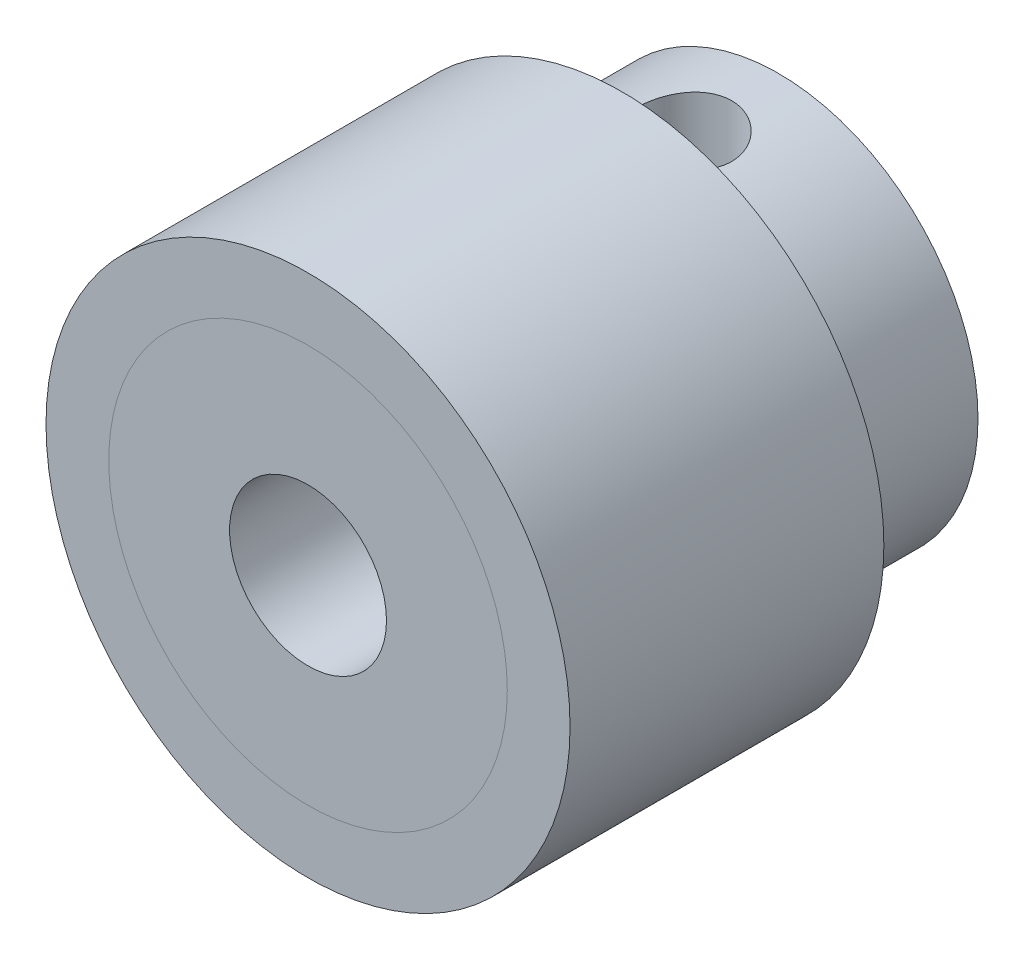
ISO-10303-21;
HEADER;
FILE_DESCRIPTION(('STEP AP214'),'2;1');
FILE_NAME('part.step','',(''),(''),'','','');
FILE_SCHEMA(('AUTOMOTIVE_DESIGN { 1 0 10303 214 1 1 1 1 }'));
ENDSEC;
DATA;
#1=APPLICATION_CONTEXT('core data for automotive mechanical design processes');
#2=APPLICATION_PROTOCOL_DEFINITION('international standard','automotive_design',2000,#1);
#3=PRODUCT_CONTEXT('',#1,'mechanical');
#4=PRODUCT('Part','Part','',(#3));
#5=PRODUCT_RELATED_PRODUCT_CATEGORY('part','',(#4));
#6=PRODUCT_DEFINITION_FORMATION('','',#4);
#7=PRODUCT_DEFINITION_CONTEXT('part definition',#1,'design');
#8=PRODUCT_DEFINITION('design','',#6,#7);
#9=PRODUCT_DEFINITION_SHAPE('','',#8);
#10=(LENGTH_UNIT() NAMED_UNIT(*) SI_UNIT(.MILLI.,.METRE.));
#11=(NAMED_UNIT(*) PLANE_ANGLE_UNIT() SI_UNIT($,.RADIAN.));
#12=(NAMED_UNIT(*) SI_UNIT($,.STERADIAN.) SOLID_ANGLE_UNIT());
#13=UNCERTAINTY_MEASURE_WITH_UNIT(LENGTH_MEASURE(1.E-05),#10,'distance_accuracy_value','');
#14=(GEOMETRIC_REPRESENTATION_CONTEXT(3) GLOBAL_UNCERTAINTY_ASSIGNED_CONTEXT((#13)) GLOBAL_UNIT_ASSIGNED_CONTEXT((#10,
#11,#12)) REPRESENTATION_CONTEXT('',''));
#15=CARTESIAN_POINT('',(0.,0.,0.));
#16=DIRECTION('',(0.,0.,1.));
#17=DIRECTION('',(1.,0.,0.));
#18=AXIS2_PLACEMENT_3D('',#15,#16,#17);
#19=CARTESIAN_POINT('',(0.,0.,5.));
#20=DIRECTION('',(0.,0.,1.));
#21=DIRECTION('',(1.,0.,0.));
#22=AXIS2_PLACEMENT_3D('',#19,#20,#21);
#23=CYLINDRICAL_SURFACE('',#22,8.35);
#24=CARTESIAN_POINT('',(0.,0.,5.));
#25=DIRECTION('',(0.,0.,1.));
#26=DIRECTION('',(1.,0.,0.));
#27=AXIS2_PLACEMENT_3D('',#24,#25,#26);
#28=CIRCLE('',#27,8.35);
#29=CARTESIAN_POINT('',(8.35,0.,5.));
#30=VERTEX_POINT('',#29);
#31=EDGE_CURVE('E11',#30,#30,#28,.T.);
#32=ORIENTED_EDGE('',*,*,#31,.T.);
#33=EDGE_LOOP('',(#32));
#34=FACE_BOUND('',#33,.T.);
#35=CARTESIAN_POINT('',(0.,0.,15.));
#36=DIRECTION('',(0.,0.,1.));
#37=DIRECTION('',(1.,0.,0.));
#38=AXIS2_PLACEMENT_3D('',#35,#36,#37);
#39=CIRCLE('',#38,8.35);
#40=CARTESIAN_POINT('',(8.35,0.,15.));
#41=VERTEX_POINT('',#40);
#42=EDGE_CURVE('E41',#41,#41,#39,.T.);
#43=ORIENTED_EDGE('',*,*,#42,.F.);
#44=EDGE_LOOP('',(#43));
#45=FACE_BOUND('',#44,.T.);
#46=ADVANCED_FACE('F38',(#34,#45),#23,.T.);
#47=CARTESIAN_POINT('',(0.,0.,5.));
#48=DIRECTION('',(0.,0.,1.));
#49=DIRECTION('',(1.,0.,0.));
#50=AXIS2_PLACEMENT_3D('',#47,#48,#49);
#51=PLANE('',#50);
#52=CARTESIAN_POINT('',(0.,0.,5.));
#53=DIRECTION('',(0.,0.,1.));
#54=DIRECTION('',(1.,0.,0.));
#55=AXIS2_PLACEMENT_3D('',#52,#53,#54);
#56=CIRCLE('',#55,6.35);
#57=CARTESIAN_POINT('',(6.35,0.,5.));
#58=VERTEX_POINT('',#57);
#59=EDGE_CURVE('E48',#58,#58,#56,.T.);
#60=ORIENTED_EDGE('',*,*,#59,.T.);
#61=EDGE_LOOP('',(#60));
#62=FACE_BOUND('',#61,.T.);
#63=ORIENTED_EDGE('',*,*,#31,.F.);
#64=EDGE_LOOP('',(#63));
#65=FACE_BOUND('',#64,.T.);
#66=ADVANCED_FACE('F56',(#62,#65),#51,.F.);
#67=CARTESIAN_POINT('',(0.,0.,15.));
#68=DIRECTION('',(0.,0.,1.));
#69=DIRECTION('',(1.,0.,0.));
#70=AXIS2_PLACEMENT_3D('',#67,#68,#69);
#71=PLANE('',#70);
#72=CARTESIAN_POINT('',(0.,0.,15.));
#73=DIRECTION('',(0.,0.,1.));
#74=DIRECTION('',(1.,0.,0.));
#75=AXIS2_PLACEMENT_3D('',#72,#73,#74);
#76=CIRCLE('',#75,6.35);
#77=CARTESIAN_POINT('',(6.35,0.,15.));
#78=VERTEX_POINT('',#77);
#79=EDGE_CURVE('E50',#78,#78,#76,.T.);
#80=ORIENTED_EDGE('',*,*,#79,.F.);
#81=EDGE_LOOP('',(#80));
#82=FACE_BOUND('',#81,.T.);
#83=ORIENTED_EDGE('',*,*,#42,.T.);
#84=EDGE_LOOP('',(#83));
#85=FACE_BOUND('',#84,.T.);
#86=ADVANCED_FACE('F62',(#82,#85),#71,.T.);
#87=CARTESIAN_POINT('',(0.,0.,5.));
#88=DIRECTION('',(0.,0.,1.));
#89=DIRECTION('',(1.,0.,0.));
#90=AXIS2_PLACEMENT_3D('',#87,#88,#89);
#91=CYLINDRICAL_SURFACE('',#90,6.35);
#92=ORIENTED_EDGE('',*,*,#59,.F.);
#93=EDGE_LOOP('',(#92));
#94=FACE_BOUND('',#93,.T.);
#95=ORIENTED_EDGE('',*,*,#79,.T.);
#96=EDGE_LOOP('',(#95));
#97=FACE_BOUND('',#96,.T.);
#98=ADVANCED_FACE('F59',(#94,#97),#91,.F.);
#99=CLOSED_SHELL('',(#46,#66,#86,#98));
#100=MANIFOLD_SOLID_BREP('B2',#99);
#101=CARTESIAN_POINT('',(0.,0.,15.));
#102=DIRECTION('',(0.,0.,-1.));
#103=DIRECTION('',(-1.,0.,0.));
#104=AXIS2_PLACEMENT_3D('',#101,#102,#103);
#105=CYLINDRICAL_SURFACE('',#104,6.35);
#106=CARTESIAN_POINT('',(0.,0.,15.));
#107=DIRECTION('',(0.,0.,1.));
#108=DIRECTION('',(1.,0.,0.));
#109=AXIS2_PLACEMENT_3D('',#106,#107,#108);
#110=CIRCLE('',#109,6.35);
#111=CARTESIAN_POINT('',(6.35,0.,15.));
#112=VERTEX_POINT('',#111);
#113=EDGE_CURVE('E37',#112,#112,#110,.T.);
#114=ORIENTED_EDGE('',*,*,#113,.F.);
#115=EDGE_LOOP('',(#114));
#116=FACE_BOUND('',#115,.T.);
#117=CARTESIAN_POINT('',(0.,0.,0.));
#118=DIRECTION('',(0.,0.,1.));
#119=DIRECTION('',(1.,0.,0.));
#120=AXIS2_PLACEMENT_3D('',#117,#118,#119);
#121=CIRCLE('',#120,6.35);
#122=CARTESIAN_POINT('',(6.35,0.,0.));
#123=VERTEX_POINT('',#122);
#124=EDGE_CURVE('E111',#123,#123,#121,.T.);
#125=ORIENTED_EDGE('',*,*,#124,.T.);
#126=EDGE_LOOP('',(#125));
#127=FACE_BOUND('',#126,.T.);
#128=CARTESIAN_POINT('',(0.,6.35,1.5));
#129=CARTESIAN_POINT('',(-0.0830209487421054,6.34999851724395,1.50000257688155));
#130=CARTESIAN_POINT('',(-0.166071705542505,6.34835548464635,1.50691570943469));
#131=CARTESIAN_POINT('',(-0.329802616773767,6.34196006203194,1.53434998922865));
#132=CARTESIAN_POINT('',(-0.410481234262166,6.33720570059271,1.55487976445553));
#133=CARTESIAN_POINT('',(-0.567078972002026,6.32511541536286,1.60885930734223));
#134=CARTESIAN_POINT('',(-0.643003359744144,6.31778241043488,1.6422944710726));
#135=CARTESIAN_POINT('',(-0.788164128517255,6.3013205537597,1.72108655368896));
#136=CARTESIAN_POINT('',(-0.85740046251478,6.29219168938456,1.76644355640646));
#137=CARTESIAN_POINT('',(-0.988504146075398,6.27294410619427,1.86868053942395));
#138=CARTESIAN_POINT('',(-1.05022983067826,6.26281145281055,1.92573957298259));
#139=CARTESIAN_POINT('',(-1.16333007962072,6.24279339171245,2.04937709118983));
#140=CARTESIAN_POINT('',(-1.21470359268491,6.23290800919793,2.1159565414756));
#141=CARTESIAN_POINT('',(-1.3062885785891,6.21436474587978,2.25782095444812));
#142=CARTESIAN_POINT('',(-1.34634507695964,6.20572463411778,2.33320849776783));
#143=CARTESIAN_POINT('',(-1.41316353749858,6.19085199880808,2.4898836012136));
#144=CARTESIAN_POINT('',(-1.43992737714355,6.18461913528441,2.57117032626984));
#145=CARTESIAN_POINT('',(-1.47892436408391,6.1754093638889,2.73578791256923));
#146=CARTESIAN_POINT('',(-1.49141049108391,6.17237584620284,2.81905560628803));
#147=CARTESIAN_POINT('',(-1.50228500188725,6.16973853210433,2.98655484676636));
#148=CARTESIAN_POINT('',(-1.50067542016751,6.17013424074105,3.07078625267775));
#149=CARTESIAN_POINT('',(-1.48360683567082,6.17425961423211,3.23590996101587));
#150=CARTESIAN_POINT('',(-1.46844577677161,6.17791755158493,3.3168351294975));
#151=CARTESIAN_POINT('',(-1.42517840490094,6.18804133190496,3.47495972740286));
#152=CARTESIAN_POINT('',(-1.39707125841275,6.19450735566558,3.55215891658072));
#153=CARTESIAN_POINT('',(-1.32844678458484,6.20958678218059,3.70145664379614));
#154=CARTESIAN_POINT('',(-1.28781841151537,6.21821926579501,3.77350213199463));
#155=CARTESIAN_POINT('',(-1.19538261640078,6.23664776102025,3.90986136281563));
#156=CARTESIAN_POINT('',(-1.14357343330741,6.24644395581355,3.97417388495946));
#157=CARTESIAN_POINT('',(-1.0286879051709,6.26640074159939,4.09495273495692));
#158=CARTESIAN_POINT('',(-0.965359229076423,6.27656427474606,4.15117883022869));
#159=CARTESIAN_POINT('',(-0.830052536460328,6.29588562944104,4.25225550259073));
#160=CARTESIAN_POINT('',(-0.758074308526317,6.30504342639666,4.29710580155034));
#161=CARTESIAN_POINT('',(-0.607191614109494,6.32135942493142,4.37423262841604));
#162=CARTESIAN_POINT('',(-0.528268312455404,6.32851195395597,4.40647358631543));
#163=CARTESIAN_POINT('',(-0.365916560598581,6.33996993682454,4.45716630266991));
#164=CARTESIAN_POINT('',(-0.282488879965402,6.34427587535181,4.47562040865422));
#165=CARTESIAN_POINT('',(-0.115553538980352,6.34948503249582,4.49785668601183));
#166=CARTESIAN_POINT('',(-0.0320918238016503,6.35046421324579,4.5019664522477));
#167=CARTESIAN_POINT('',(0.134326079532355,6.34912429021221,4.49629106790022));
#168=CARTESIAN_POINT('',(0.217282307495617,6.34680544961474,4.48650702605959));
#169=CARTESIAN_POINT('',(0.379220169859582,6.33917838174839,4.45359261840112));
#170=CARTESIAN_POINT('',(0.458239510996915,6.33390950352625,4.43063783257741));
#171=CARTESIAN_POINT('',(0.611304086387361,6.32097400029951,4.37223149966576));
#172=CARTESIAN_POINT('',(0.685348850798218,6.31330714919518,4.33677877413379));
#173=CARTESIAN_POINT('',(0.827689304318973,6.29624149651372,4.25372644839969));
#174=CARTESIAN_POINT('',(0.895872345524985,6.28681663475878,4.20593926429422));
#175=CARTESIAN_POINT('',(1.02336854827638,6.26732668110161,4.09981752950993));
#176=CARTESIAN_POINT('',(1.08268034970592,6.25726149136242,4.04148136451076));
#177=CARTESIAN_POINT('',(1.19207580420077,6.23735679650375,3.91440401687872));
#178=CARTESIAN_POINT('',(1.24193090389248,6.22752694929493,3.84546426640513));
#179=CARTESIAN_POINT('',(1.32936029211664,6.20945265145426,3.70000057804812));
#180=CARTESIAN_POINT('',(1.36693512985994,6.2012081299286,3.6234769795371));
#181=CARTESIAN_POINT('',(1.4284663653329,6.1873240848113,3.46543566793411));
#182=CARTESIAN_POINT('',(1.45250270111901,6.18166930794986,3.3839504859383));
#183=CARTESIAN_POINT('',(1.48649761919312,6.17358371023306,3.21794412141734));
#184=CARTESIAN_POINT('',(1.49645889346788,6.17115227288946,3.13342352261579));
#185=CARTESIAN_POINT('',(1.50189189090823,6.16983199335337,2.96606112146151));
#186=CARTESIAN_POINT('',(1.49772748776163,6.1708541839276,2.88323163293272));
#187=CARTESIAN_POINT('',(1.47585131759939,6.17612233302334,2.71949127444565));
#188=CARTESIAN_POINT('',(1.45813976860322,6.18036823966433,2.63858037363241));
#189=CARTESIAN_POINT('',(1.40986066978044,6.19155859321836,2.48132098353121));
#190=CARTESIAN_POINT('',(1.37935441810504,6.198490161484,2.40495269713613));
#191=CARTESIAN_POINT('',(1.30640175172683,6.21427398682872,2.25836716284176));
#192=CARTESIAN_POINT('',(1.26395386257482,6.22312648105611,2.18815067591788));
#193=CARTESIAN_POINT('',(1.16715206254849,6.24201391004487,2.05408721321493));
#194=CARTESIAN_POINT('',(1.11254249880655,6.25207168946107,1.9904280187217));
#195=CARTESIAN_POINT('',(0.99347494488921,6.27209257501468,1.8730583428238));
#196=CARTESIAN_POINT('',(0.929014653170164,6.28205565844781,1.81935019290582));
#197=CARTESIAN_POINT('',(0.790855077532084,6.30095070373692,1.7225916638141));
#198=CARTESIAN_POINT('',(0.717026696497849,6.30986403352165,1.67972173683658));
#199=CARTESIAN_POINT('',(0.563011253816948,6.32546353967866,1.60706930320467));
#200=CARTESIAN_POINT('',(0.482829165239745,6.33215143699731,1.577276678042));
#201=CARTESIAN_POINT('',(0.335568702357189,6.34146337323501,1.53645636515545));
#202=CARTESIAN_POINT('',(0.269238102345869,6.34464362420469,1.52281315294047));
#203=CARTESIAN_POINT('',(0.135278213529582,6.34891247920239,1.50458419109222));
#204=CARTESIAN_POINT('',(0.0676490025691891,6.35000120821274,1.49999790024723));
#205=CARTESIAN_POINT('',(0.,6.35,1.5));
#206=B_SPLINE_CURVE_WITH_KNOTS('',3,(#128,#129,#130,#131,#132,#133,#134,#135,#136,#137,#138,
#139,#140,#141,#142,#143,#144,#145,#146,#147,#148,#149,#150,#151,#152,#153,#154,#155,#156,#157,
#158,#159,#160,#161,#162,#163,#164,#165,#166,#167,#168,#169,#170,#171,#172,#173,#174,#175,#176,
#177,#178,#179,#180,#181,#182,#183,#184,#185,#186,#187,#188,#189,#190,#191,#192,#193,#194,#195,
#196,#197,#198,#199,#200,#201,#202,#203,#204,#205),.UNSPECIFIED.,.T.,.F.,(4,2,2,2,2,2,2,2,2,2,2,
2,2,2,2,2,2,2,2,2,2,2,2,2,2,2,2,2,2,2,2,2,2,2,2,2,2,2,4),(0.,0.248815070913742,
0.497787950658725,0.746479911109811,0.995173620349721,1.24800235932538,1.50085676043726,
1.75702225097101,2.01315154998107,2.26466865776918,2.51614946391932,2.76223359968085,
3.00833358145962,3.25668218758358,3.50506993876883,3.75975438391661,4.01444505532946,
4.26984909538288,4.52520963709546,4.77469868586512,5.02416782622496,5.27038608564858,
5.51662756746636,5.76686059612936,6.01713195064178,6.2728421065447,6.52854082474265,
6.78271350366645,7.03683756311169,7.28446569177385,7.53208983534431,7.7785409483085,
8.02502250427131,8.27727905299751,8.5295946298092,8.78586924469398,9.04194521710613,
9.24470244341197,9.44744755324905),.UNSPECIFIED.);
#207=CARTESIAN_POINT('',(0.,6.35,1.5));
#208=VERTEX_POINT('',#207);
#209=EDGE_CURVE('E121',#208,#208,#206,.T.);
#210=ORIENTED_EDGE('',*,*,#209,.F.);
#211=EDGE_LOOP('',(#210));
#212=FACE_BOUND('',#211,.T.);
#213=ADVANCED_FACE('F99',(#116,#127,#212),#105,.T.);
#214=CARTESIAN_POINT('',(0.,0.,15.));
#215=DIRECTION('',(0.,0.,-1.));
#216=DIRECTION('',(-1.,0.,0.));
#217=AXIS2_PLACEMENT_3D('',#214,#215,#216);
#218=CYLINDRICAL_SURFACE('',#217,2.5);
#219=CARTESIAN_POINT('',(0.,0.,0.));
#220=DIRECTION('',(0.,0.,1.));
#221=DIRECTION('',(1.,0.,0.));
#222=AXIS2_PLACEMENT_3D('',#219,#220,#221);
#223=CIRCLE('',#222,2.5);
#224=CARTESIAN_POINT('',(2.5,0.,0.));
#225=VERTEX_POINT('',#224);
#226=EDGE_CURVE('E118',#225,#225,#223,.T.);
#227=ORIENTED_EDGE('',*,*,#226,.F.);
#228=EDGE_LOOP('',(#227));
#229=FACE_BOUND('',#228,.T.);
#230=CARTESIAN_POINT('',(0.,0.,15.));
#231=DIRECTION('',(0.,0.,1.));
#232=DIRECTION('',(1.,0.,0.));
#233=AXIS2_PLACEMENT_3D('',#230,#231,#232);
#234=CIRCLE('',#233,2.5);
#235=CARTESIAN_POINT('',(2.5,0.,15.));
#236=VERTEX_POINT('',#235);
#237=EDGE_CURVE('E116',#236,#236,#234,.T.);
#238=ORIENTED_EDGE('',*,*,#237,.T.);
#239=EDGE_LOOP('',(#238));
#240=FACE_BOUND('',#239,.T.);
#241=CARTESIAN_POINT('',(0.,2.5,1.5));
#242=CARTESIAN_POINT('',(-0.0767298334620157,2.49999625789732,1.50000409100988));
#243=CARTESIAN_POINT('',(-0.153582320644178,2.4964290461501,1.50592867092626));
#244=CARTESIAN_POINT('',(-0.304975509530679,2.48249903608568,1.52932431951533));
#245=CARTESIAN_POINT('',(-0.379510034596047,2.47211948032719,1.54682386185422));
#246=CARTESIAN_POINT('',(-0.523751827790837,2.44561558054488,1.59238636116686));
#247=CARTESIAN_POINT('',(-0.593481028226566,2.42951973272944,1.62039695816316));
#248=CARTESIAN_POINT('',(-0.727030318214658,2.39295367626407,1.68586033314103));
#249=CARTESIAN_POINT('',(-0.790851869416383,2.37248455380255,1.72331076696875));
#250=CARTESIAN_POINT('',(-0.916299278999315,2.32705360719088,1.80977482670858));
#251=CARTESIAN_POINT('',(-0.977384020081415,2.30186792195985,1.85945369535139));
#252=CARTESIAN_POINT('',(-1.09088270411891,2.25030439279634,1.96746720382827));
#253=CARTESIAN_POINT('',(-1.14328534948112,2.22392505153571,2.02581293718732));
#254=CARTESIAN_POINT('',(-1.24444996762974,2.1691106699591,2.15792351049673));
#255=CARTESIAN_POINT('',(-1.29197766378809,2.14082017703649,2.23270177098129));
#256=CARTESIAN_POINT('',(-1.37361437764896,2.08938301412124,2.39084657324311));
#257=CARTESIAN_POINT('',(-1.4077451733516,2.06622802273938,2.47419889624757));
#258=CARTESIAN_POINT('',(-1.45440601714221,2.0335462966093,2.62659645065324));
#259=CARTESIAN_POINT('',(-1.47016197246826,2.02207883137591,2.69423599861032));
#260=CARTESIAN_POINT('',(-1.49216172340475,2.00590308295503,2.83180371583036));
#261=CARTESIAN_POINT('',(-1.49841734556836,2.00118639643759,2.90172892875449));
#262=CARTESIAN_POINT('',(-1.50105508796009,1.99920922463856,3.04201149421734));
#263=CARTESIAN_POINT('',(-1.49741783408419,2.00196337012718,3.1123694250932));
#264=CARTESIAN_POINT('',(-1.48046060478828,2.01453261443741,3.25127877542759));
#265=CARTESIAN_POINT('',(-1.46713334620103,2.02435302432226,3.31982879584744));
#266=CARTESIAN_POINT('',(-1.43173921881792,2.04953186944258,3.4525302421281));
#267=CARTESIAN_POINT('',(-1.40978748666087,2.06481711652537,3.51672705392448));
#268=CARTESIAN_POINT('',(-1.35795061770837,2.09927051350828,3.64069499092812));
#269=CARTESIAN_POINT('',(-1.32806257259705,2.11844008623465,3.70046448342393));
#270=CARTESIAN_POINT('',(-1.25517983184583,2.16255327268985,3.8249840971228));
#271=CARTESIAN_POINT('',(-1.21080724397723,2.18792043372992,3.88877809295493));
#272=CARTESIAN_POINT('',(-1.11291092784003,2.23930599764381,4.00867648366701));
#273=CARTESIAN_POINT('',(-1.05937845100579,2.26532500262149,4.06477343397651));
#274=CARTESIAN_POINT('',(-0.935811834382966,2.31935504958317,4.17561298182176));
#275=CARTESIAN_POINT('',(-0.864517682704957,2.34713836268532,4.22907730601599));
#276=CARTESIAN_POINT('',(-0.712276050459,2.39772428433981,4.32312204719791));
#277=CARTESIAN_POINT('',(-0.631333763943563,2.42052955425515,4.36370935378995));
#278=CARTESIAN_POINT('',(-0.467197585268205,2.45730392066151,4.4279321827959));
#279=CARTESIAN_POINT('',(-0.384467624173579,2.47173957439704,4.45247535571591));
#280=CARTESIAN_POINT('',(-0.215047895144639,2.49218842813551,4.48701119740538));
#281=CARTESIAN_POINT('',(-0.128363005661319,2.49821172952738,4.49702131775357));
#282=CARTESIAN_POINT('',(0.033714614377396,2.5009057037461,4.50150784767831));
#283=CARTESIAN_POINT('',(0.109042473418717,2.49873521714286,4.49790885508517));
#284=CARTESIAN_POINT('',(0.25782940198606,2.48778712087048,4.47957414692808));
#285=CARTESIAN_POINT('',(0.331288509376105,2.47900964518037,4.46483865719419));
#286=CARTESIAN_POINT('',(0.472574932157612,2.4559479244219,4.42545656718754));
#287=CARTESIAN_POINT('',(0.540495750928483,2.44180275662555,4.40105965092653));
#288=CARTESIAN_POINT('',(0.671265749087262,2.40913880862845,4.34332262363473));
#289=CARTESIAN_POINT('',(0.734113924963908,2.39061916586511,4.30998074865333));
#290=CARTESIAN_POINT('',(0.860006262823863,2.3484549623736,4.2314430207913));
#291=CARTESIAN_POINT('',(0.922394150456836,2.3244780273988,4.18537617092161));
#292=CARTESIAN_POINT('',(1.03902603131014,2.27474265574732,4.08460860651138));
#293=CARTESIAN_POINT('',(1.09326040273738,2.2489821658636,4.02989784514746));
#294=CARTESIAN_POINT('',(1.19931996735579,2.19445423909891,3.90508960996285));
#295=CARTESIAN_POINT('',(1.24991019630915,2.16573241746291,3.8339161145345));
#296=CARTESIAN_POINT('',(1.33845238915667,2.1121618206671,3.6827839754318));
#297=CARTESIAN_POINT('',(1.37641766769781,2.0873089799769,3.60283470610722));
#298=CARTESIAN_POINT('',(1.43142578795776,2.04984909240519,3.45375697769331));
#299=CARTESIAN_POINT('',(1.4512162533619,2.03575659328729,3.38601968764141));
#300=CARTESIAN_POINT('',(1.48113663905972,2.01409605743544,3.2474679219199));
#301=CARTESIAN_POINT('',(1.49127995297631,2.00651897642721,3.17665785567217));
#302=CARTESIAN_POINT('',(1.50134130416631,1.99900446616268,3.03362305240297));
#303=CARTESIAN_POINT('',(1.50122089107869,1.99909576445937,2.96139400931296));
#304=CARTESIAN_POINT('',(1.49066472959328,2.0069771789285,2.81810556439054));
#305=CARTESIAN_POINT('',(1.48022337215759,2.0147714813882,2.7470468199194));
#306=CARTESIAN_POINT('',(1.45040174148913,2.0363318524298,2.61151158242781));
#307=CARTESIAN_POINT('',(1.43147636845351,2.04979211805581,2.54688290569313));
#308=CARTESIAN_POINT('',(1.38563242076993,2.08105501960152,2.42166274552578));
#309=CARTESIAN_POINT('',(1.35871083588479,2.09885929040482,2.36107279303945));
#310=CARTESIAN_POINT('',(1.29289245555732,2.14012990550917,2.23568014277922));
#311=CARTESIAN_POINT('',(1.25279167675753,2.16404587582639,2.17165889614569));
#312=CARTESIAN_POINT('',(1.16375698389085,2.21320127030768,2.05061992738271));
#313=CARTESIAN_POINT('',(1.11481579607798,2.23844177205021,1.99360803784744));
#314=CARTESIAN_POINT('',(1.00009777425734,2.29225690291476,1.87864905086833));
#315=CARTESIAN_POINT('',(0.932876819313904,2.32070308663658,1.82206892510381));
#316=CARTESIAN_POINT('',(0.788462434445589,2.37365428872367,1.72090214413669));
#317=CARTESIAN_POINT('',(0.71126544450154,2.39815789310936,1.67631978801521));
#318=CARTESIAN_POINT('',(0.551125230801453,2.43985578654394,1.60221419242626));
#319=CARTESIAN_POINT('',(0.468430086957213,2.45725077479787,1.57227193507317));
#320=CARTESIAN_POINT('',(0.297973306118807,2.48366273001246,1.52727530478902));
#321=CARTESIAN_POINT('',(0.210232099648612,2.49271125871485,1.51216483214301));
#322=CARTESIAN_POINT('',(0.101558096917536,2.49802001168187,1.50330254529134));
#323=CARTESIAN_POINT('',(0.0812762590282774,2.49876114656362,1.5020655826939));
#324=CARTESIAN_POINT('',(0.0406658206871123,2.49975164517367,1.50041375362914));
#325=CARTESIAN_POINT('',(0.0203372186375694,2.50000099184316,1.4999989156791));
#326=CARTESIAN_POINT('',(0.,2.5,1.5));
#327=B_SPLINE_CURVE_WITH_KNOTS('',3,(#241,#242,#243,#244,#245,#246,#247,#248,#249,#250,#251,
#252,#253,#254,#255,#256,#257,#258,#259,#260,#261,#262,#263,#264,#265,#266,#267,#268,#269,#270,
#271,#272,#273,#274,#275,#276,#277,#278,#279,#280,#281,#282,#283,#284,#285,#286,#287,#288,#289,
#290,#291,#292,#293,#294,#295,#296,#297,#298,#299,#300,#301,#302,#303,#304,#305,#306,#307,#308,
#309,#310,#311,#312,#313,#314,#315,#316,#317,#318,#319,#320,#321,#322,#323,#324,#325,#326),
.UNSPECIFIED.,.T.,.F.,(4,2,2,2,2,2,2,2,2,2,2,2,2,2,2,2,2,2,2,2,2,2,2,2,2,2,2,2,2,2,2,2,2,2,2,2,
2,2,2,2,2,2,4),(0.,0.230102237548649,0.460772627520012,0.690308884600012,0.919788197992274,
1.16681590732473,1.414162579348,1.69183813189807,1.96906040692092,2.17933829855633,
2.38935420916578,2.59978170870726,2.81036753273872,3.01823267593207,3.22617409809868,
3.47046995225163,3.71500044803674,3.99360957884691,4.27206939275324,4.53296790696559,
4.79355286918236,5.01875602722426,5.24395461863455,5.46367785689772,5.68344445659025,
5.92601365818362,6.16886690081836,6.44336762428009,6.71757792616456,6.93257787314692,
7.14727888733318,7.36278425777433,7.57840681155725,7.78364098331142,7.98895251523035,
8.22578610052286,8.46281544370207,8.73854311775518,9.01436946031985,9.28175654462676,
9.54812832184448,9.60911473335177,9.6701032602764),.UNSPECIFIED.);
#328=CARTESIAN_POINT('',(0.,2.5,1.5));
#329=VERTEX_POINT('',#328);
#330=EDGE_CURVE('E103',#329,#329,#327,.T.);
#331=ORIENTED_EDGE('',*,*,#330,.T.);
#332=EDGE_LOOP('',(#331));
#333=FACE_BOUND('',#332,.T.);
#334=ADVANCED_FACE('F132',(#229,#240,#333),#218,.F.);
#335=CARTESIAN_POINT('',(0.,0.,15.));
#336=DIRECTION('',(0.,0.,1.));
#337=DIRECTION('',(1.,0.,0.));
#338=AXIS2_PLACEMENT_3D('',#335,#336,#337);
#339=PLANE('',#338);
#340=ORIENTED_EDGE('',*,*,#113,.T.);
#341=EDGE_LOOP('',(#340));
#342=FACE_BOUND('',#341,.T.);
#343=ORIENTED_EDGE('',*,*,#237,.F.);
#344=EDGE_LOOP('',(#343));
#345=FACE_BOUND('',#344,.T.);
#346=ADVANCED_FACE('F137',(#342,#345),#339,.T.);
#347=CARTESIAN_POINT('',(0.,0.,0.));
#348=DIRECTION('',(0.,0.,1.));
#349=DIRECTION('',(1.,0.,0.));
#350=AXIS2_PLACEMENT_3D('',#347,#348,#349);
#351=PLANE('',#350);
#352=ORIENTED_EDGE('',*,*,#124,.F.);
#353=EDGE_LOOP('',(#352));
#354=FACE_BOUND('',#353,.T.);
#355=ORIENTED_EDGE('',*,*,#226,.T.);
#356=EDGE_LOOP('',(#355));
#357=FACE_BOUND('',#356,.T.);
#358=ADVANCED_FACE('F130',(#354,#357),#351,.F.);
#359=CARTESIAN_POINT('',(0.,6.35,3.));
#360=DIRECTION('',(0.,-1.,0.));
#361=DIRECTION('',(0.,0.,-1.));
#362=AXIS2_PLACEMENT_3D('',#359,#360,#361);
#363=CYLINDRICAL_SURFACE('',#362,1.5);
#364=ORIENTED_EDGE('',*,*,#330,.F.);
#365=EDGE_LOOP('',(#364));
#366=FACE_BOUND('',#365,.T.);
#367=ORIENTED_EDGE('',*,*,#209,.T.);
#368=EDGE_LOOP('',(#367));
#369=FACE_BOUND('',#368,.T.);
#370=ADVANCED_FACE('F127',(#366,#369),#363,.F.);
#371=CLOSED_SHELL('',(#213,#334,#346,#358,#370));
#372=MANIFOLD_SOLID_BREP('B6',#371);
#373=ADVANCED_BREP_SHAPE_REPRESENTATION('',(#18,#100,#372),#14);
#374=SHAPE_DEFINITION_REPRESENTATION(#9,#373);
ENDSEC;
END-ISO-10303-21;
